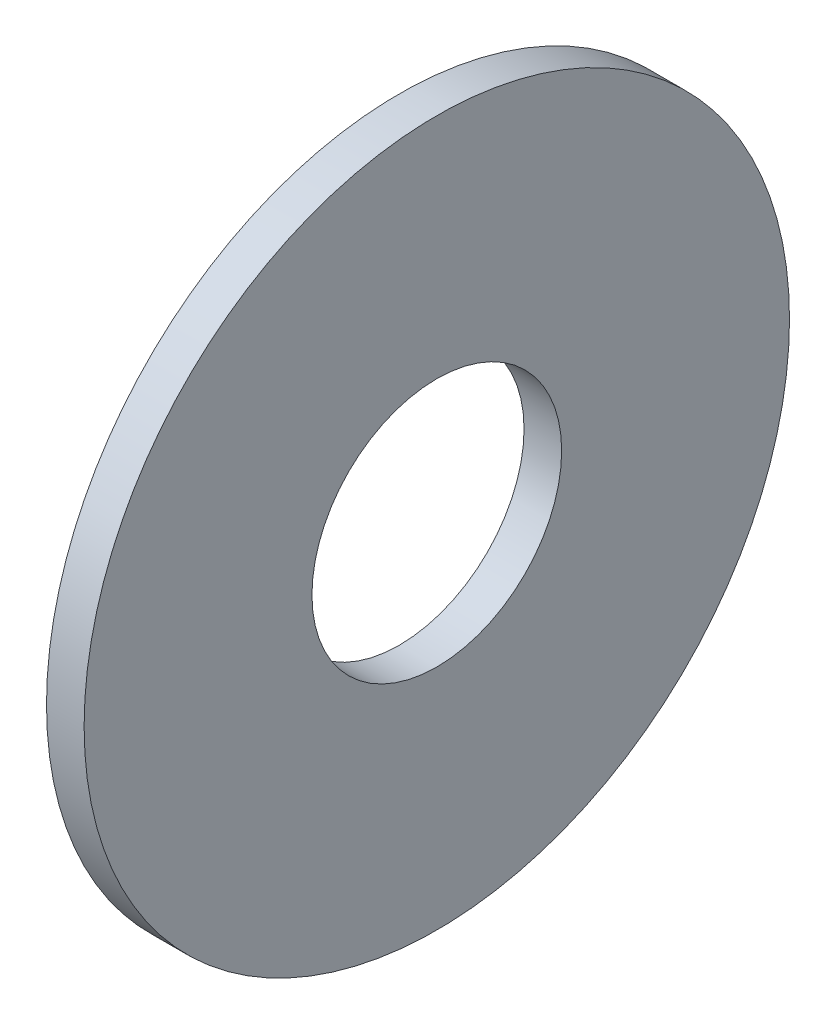
ISO-10303-21;
HEADER;
FILE_DESCRIPTION(('STEP AP214'),'2;1');
FILE_NAME('part.step','',(''),(''),'','','');
FILE_SCHEMA(('AUTOMOTIVE_DESIGN { 1 0 10303 214 1 1 1 1 }'));
ENDSEC;
DATA;
#1=APPLICATION_CONTEXT('core data for automotive mechanical design processes');
#2=APPLICATION_PROTOCOL_DEFINITION('international standard','automotive_design',2000,#1);
#3=PRODUCT_CONTEXT('',#1,'mechanical');
#4=PRODUCT('Part','Part','',(#3));
#5=PRODUCT_RELATED_PRODUCT_CATEGORY('part','',(#4));
#6=PRODUCT_DEFINITION_FORMATION('','',#4);
#7=PRODUCT_DEFINITION_CONTEXT('part definition',#1,'design');
#8=PRODUCT_DEFINITION('design','',#6,#7);
#9=PRODUCT_DEFINITION_SHAPE('','',#8);
#10=(LENGTH_UNIT() NAMED_UNIT(*) SI_UNIT(.MILLI.,.METRE.));
#11=(NAMED_UNIT(*) PLANE_ANGLE_UNIT() SI_UNIT($,.RADIAN.));
#12=(NAMED_UNIT(*) SI_UNIT($,.STERADIAN.) SOLID_ANGLE_UNIT());
#13=UNCERTAINTY_MEASURE_WITH_UNIT(LENGTH_MEASURE(1.E-05),#10,'distance_accuracy_value','');
#14=(GEOMETRIC_REPRESENTATION_CONTEXT(3) GLOBAL_UNCERTAINTY_ASSIGNED_CONTEXT((#13)) GLOBAL_UNIT_ASSIGNED_CONTEXT((#10,
#11,#12)) REPRESENTATION_CONTEXT('',''));
#15=CARTESIAN_POINT('',(0.,0.,0.));
#16=DIRECTION('',(0.,0.,1.));
#17=DIRECTION('',(1.,0.,0.));
#18=AXIS2_PLACEMENT_3D('',#15,#16,#17);
#19=CARTESIAN_POINT('',(-34.9249999999999,0.,0.));
#20=DIRECTION('',(-1.,0.,0.));
#21=DIRECTION('',(0.,0.,1.));
#22=AXIS2_PLACEMENT_3D('',#19,#20,#21);
#23=CYLINDRICAL_SURFACE('',#22,13.4874);
#24=CARTESIAN_POINT('',(0.,0.,0.));
#25=DIRECTION('',(-1.,0.,0.));
#26=DIRECTION('',(0.,0.,1.));
#27=AXIS2_PLACEMENT_3D('',#24,#25,#26);
#28=CIRCLE('',#27,13.4874);
#29=CARTESIAN_POINT('',(0.,0.,13.4874));
#30=VERTEX_POINT('',#29);
#31=EDGE_CURVE('E10',#30,#30,#28,.T.);
#32=ORIENTED_EDGE('',*,*,#31,.F.);
#33=EDGE_LOOP('',(#32));
#34=FACE_BOUND('',#33,.T.);
#35=CARTESIAN_POINT('',(-4.06399999999999,0.,0.));
#36=DIRECTION('',(-1.,0.,0.));
#37=DIRECTION('',(0.,0.,1.));
#38=AXIS2_PLACEMENT_3D('',#35,#36,#37);
#39=CIRCLE('',#38,13.4874);
#40=CARTESIAN_POINT('',(-4.06399999999999,0.,13.4874));
#41=VERTEX_POINT('',#40);
#42=EDGE_CURVE('E44',#41,#41,#39,.T.);
#43=ORIENTED_EDGE('',*,*,#42,.T.);
#44=EDGE_LOOP('',(#43));
#45=FACE_BOUND('',#44,.T.);
#46=ADVANCED_FACE('F30',(#34,#45),#23,.F.);
#47=CARTESIAN_POINT('',(0.,13.4874,0.));
#48=DIRECTION('',(-1.,0.,0.));
#49=DIRECTION('',(0.,0.,1.));
#50=AXIS2_PLACEMENT_3D('',#47,#48,#49);
#51=PLANE('',#50);
#52=CARTESIAN_POINT('',(0.,0.,0.));
#53=DIRECTION('',(-1.,0.,0.));
#54=DIRECTION('',(0.,0.,1.));
#55=AXIS2_PLACEMENT_3D('',#52,#53,#54);
#56=CIRCLE('',#55,38.1);
#57=CARTESIAN_POINT('',(0.,0.,38.1));
#58=VERTEX_POINT('',#57);
#59=EDGE_CURVE('E36',#58,#58,#56,.T.);
#60=ORIENTED_EDGE('',*,*,#59,.F.);
#61=EDGE_LOOP('',(#60));
#62=FACE_BOUND('',#61,.T.);
#63=ORIENTED_EDGE('',*,*,#31,.T.);
#64=EDGE_LOOP('',(#63));
#65=FACE_BOUND('',#64,.T.);
#66=ADVANCED_FACE('F59',(#62,#65),#51,.F.);
#67=CARTESIAN_POINT('',(-34.9249999999999,0.,0.));
#68=DIRECTION('',(-1.,0.,0.));
#69=DIRECTION('',(0.,0.,1.));
#70=AXIS2_PLACEMENT_3D('',#67,#68,#69);
#71=CYLINDRICAL_SURFACE('',#70,38.1);
#72=CARTESIAN_POINT('',(-4.064,0.,0.));
#73=DIRECTION('',(-1.,0.,0.));
#74=DIRECTION('',(0.,0.,1.));
#75=AXIS2_PLACEMENT_3D('',#72,#73,#74);
#76=CIRCLE('',#75,38.1);
#77=CARTESIAN_POINT('',(-4.064,0.,38.1));
#78=VERTEX_POINT('',#77);
#79=EDGE_CURVE('E40',#78,#78,#76,.T.);
#80=ORIENTED_EDGE('',*,*,#79,.F.);
#81=EDGE_LOOP('',(#80));
#82=FACE_BOUND('',#81,.T.);
#83=ORIENTED_EDGE('',*,*,#59,.T.);
#84=EDGE_LOOP('',(#83));
#85=FACE_BOUND('',#84,.T.);
#86=ADVANCED_FACE('F54',(#82,#85),#71,.T.);
#87=CARTESIAN_POINT('',(-4.064,38.1,0.));
#88=DIRECTION('',(1.,0.,0.));
#89=DIRECTION('',(0.,0.,-1.));
#90=AXIS2_PLACEMENT_3D('',#87,#88,#89);
#91=PLANE('',#90);
#92=ORIENTED_EDGE('',*,*,#42,.F.);
#93=EDGE_LOOP('',(#92));
#94=FACE_BOUND('',#93,.T.);
#95=ORIENTED_EDGE('',*,*,#79,.T.);
#96=EDGE_LOOP('',(#95));
#97=FACE_BOUND('',#96,.T.);
#98=ADVANCED_FACE('F51',(#94,#97),#91,.F.);
#99=CLOSED_SHELL('',(#46,#66,#86,#98));
#100=MANIFOLD_SOLID_BREP('B2',#99);
#101=ADVANCED_BREP_SHAPE_REPRESENTATION('',(#18,#100),#14);
#102=SHAPE_DEFINITION_REPRESENTATION(#9,#101);
ENDSEC;
END-ISO-10303-21;
